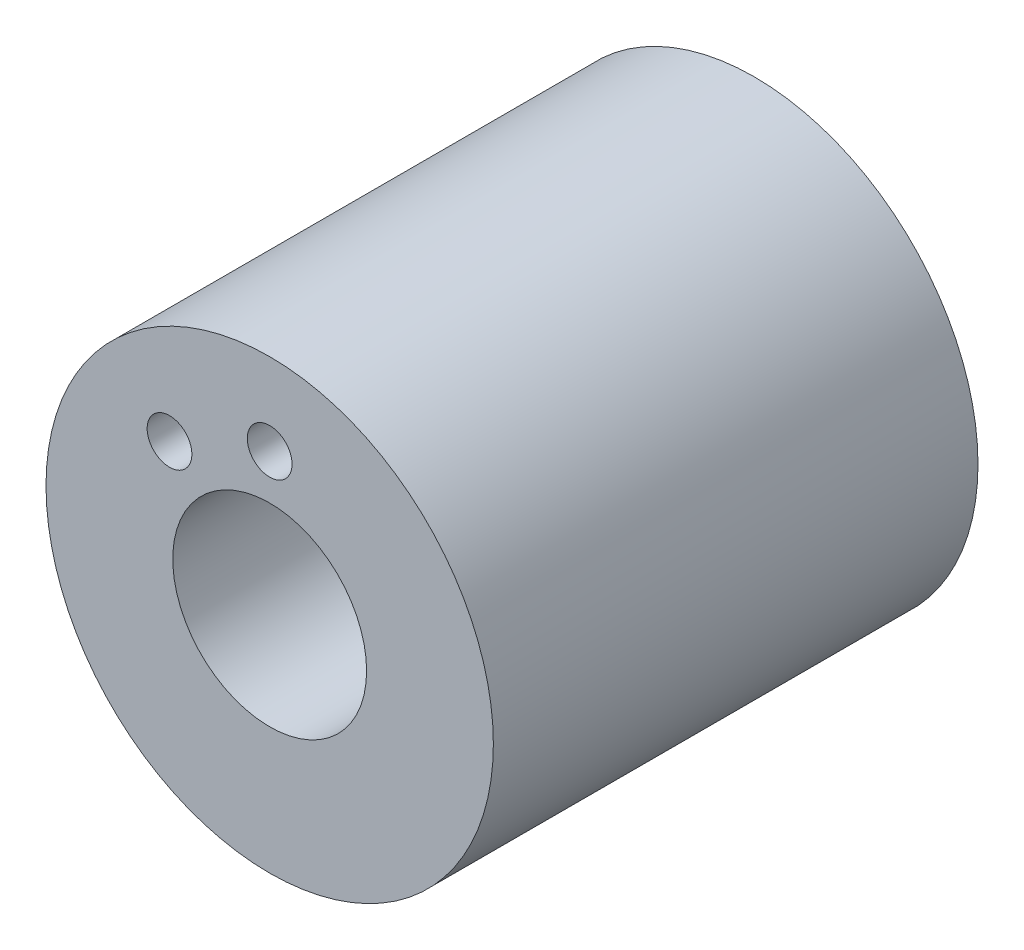
ISO-10303-21;
HEADER;
FILE_DESCRIPTION(('STEP AP214'),'2;1');
FILE_NAME('part.step','',(''),(''),'','','');
FILE_SCHEMA(('AUTOMOTIVE_DESIGN { 1 0 10303 214 1 1 1 1 }'));
ENDSEC;
DATA;
#1=APPLICATION_CONTEXT('core data for automotive mechanical design processes');
#2=APPLICATION_PROTOCOL_DEFINITION('international standard','automotive_design',2000,#1);
#3=PRODUCT_CONTEXT('',#1,'mechanical');
#4=PRODUCT('Part','Part','',(#3));
#5=PRODUCT_RELATED_PRODUCT_CATEGORY('part','',(#4));
#6=PRODUCT_DEFINITION_FORMATION('','',#4);
#7=PRODUCT_DEFINITION_CONTEXT('part definition',#1,'design');
#8=PRODUCT_DEFINITION('design','',#6,#7);
#9=PRODUCT_DEFINITION_SHAPE('','',#8);
#10=(LENGTH_UNIT() NAMED_UNIT(*) SI_UNIT(.MILLI.,.METRE.));
#11=(NAMED_UNIT(*) PLANE_ANGLE_UNIT() SI_UNIT($,.RADIAN.));
#12=(NAMED_UNIT(*) SI_UNIT($,.STERADIAN.) SOLID_ANGLE_UNIT());
#13=UNCERTAINTY_MEASURE_WITH_UNIT(LENGTH_MEASURE(1.E-05),#10,'distance_accuracy_value','');
#14=(GEOMETRIC_REPRESENTATION_CONTEXT(3) GLOBAL_UNCERTAINTY_ASSIGNED_CONTEXT((#13)) GLOBAL_UNIT_ASSIGNED_CONTEXT((#10,
#11,#12)) REPRESENTATION_CONTEXT('',''));
#15=CARTESIAN_POINT('',(0.,0.,0.));
#16=DIRECTION('',(0.,0.,1.));
#17=DIRECTION('',(1.,0.,0.));
#18=AXIS2_PLACEMENT_3D('',#15,#16,#17);
#19=CARTESIAN_POINT('',(0.,0.,16.25));
#20=DIRECTION('',(0.,0.,1.));
#21=DIRECTION('',(1.,0.,0.));
#22=AXIS2_PLACEMENT_3D('',#19,#20,#21);
#23=PLANE('',#22);
#24=CARTESIAN_POINT('',(0.,9.5,16.25));
#25=DIRECTION('',(0.,0.,1.));
#26=DIRECTION('',(1.,0.,0.));
#27=AXIS2_PLACEMENT_3D('',#24,#25,#26);
#28=CIRCLE('',#27,1.5);
#29=CARTESIAN_POINT('',(1.5,9.5,16.25));
#30=VERTEX_POINT('',#29);
#31=EDGE_CURVE('E47',#30,#30,#28,.T.);
#32=ORIENTED_EDGE('',*,*,#31,.F.);
#33=EDGE_LOOP('',(#32));
#34=FACE_BOUND('',#33,.T.);
#35=CARTESIAN_POINT('',(0.,0.,16.25));
#36=DIRECTION('',(0.,0.,1.));
#37=DIRECTION('',(1.,0.,0.));
#38=AXIS2_PLACEMENT_3D('',#35,#36,#37);
#39=CIRCLE('',#38,15.);
#40=CARTESIAN_POINT('',(15.,0.,16.25));
#41=VERTEX_POINT('',#40);
#42=EDGE_CURVE('E10',#41,#41,#39,.T.);
#43=ORIENTED_EDGE('',*,*,#42,.T.);
#44=EDGE_LOOP('',(#43));
#45=FACE_BOUND('',#44,.T.);
#46=CARTESIAN_POINT('',(0.,0.,16.25));
#47=DIRECTION('',(0.,0.,1.));
#48=DIRECTION('',(1.,0.,0.));
#49=AXIS2_PLACEMENT_3D('',#46,#47,#48);
#50=CIRCLE('',#49,6.5);
#51=CARTESIAN_POINT('',(6.5,0.,16.25));
#52=VERTEX_POINT('',#51);
#53=EDGE_CURVE('E42',#52,#52,#50,.T.);
#54=ORIENTED_EDGE('',*,*,#53,.F.);
#55=EDGE_LOOP('',(#54));
#56=FACE_BOUND('',#55,.T.);
#57=CARTESIAN_POINT('',(-6.71751442127221,6.71751442127219,16.25));
#58=DIRECTION('',(0.,0.,1.));
#59=DIRECTION('',(1.,0.,0.));
#60=AXIS2_PLACEMENT_3D('',#57,#58,#59);
#61=CIRCLE('',#60,1.5);
#62=CARTESIAN_POINT('',(-5.21751442127221,6.71751442127219,16.25));
#63=VERTEX_POINT('',#62);
#64=EDGE_CURVE('E53',#63,#63,#61,.T.);
#65=ORIENTED_EDGE('',*,*,#64,.F.);
#66=EDGE_LOOP('',(#65));
#67=FACE_BOUND('',#66,.T.);
#68=ADVANCED_FACE('F31',(#34,#45,#56,#67),#23,.T.);
#69=CARTESIAN_POINT('',(0.,0.,-16.25));
#70=DIRECTION('',(0.,0.,1.));
#71=DIRECTION('',(1.,0.,0.));
#72=AXIS2_PLACEMENT_3D('',#69,#70,#71);
#73=PLANE('',#72);
#74=CARTESIAN_POINT('',(0.,0.,-16.25));
#75=DIRECTION('',(0.,0.,1.));
#76=DIRECTION('',(1.,0.,0.));
#77=AXIS2_PLACEMENT_3D('',#74,#75,#76);
#78=CIRCLE('',#77,15.);
#79=CARTESIAN_POINT('',(15.,0.,-16.25));
#80=VERTEX_POINT('',#79);
#81=EDGE_CURVE('E35',#80,#80,#78,.T.);
#82=ORIENTED_EDGE('',*,*,#81,.F.);
#83=EDGE_LOOP('',(#82));
#84=FACE_BOUND('',#83,.T.);
#85=CARTESIAN_POINT('',(0.,0.,-16.25));
#86=DIRECTION('',(0.,0.,1.));
#87=DIRECTION('',(1.,0.,0.));
#88=AXIS2_PLACEMENT_3D('',#85,#86,#87);
#89=CIRCLE('',#88,6.5);
#90=CARTESIAN_POINT('',(6.5,0.,-16.25));
#91=VERTEX_POINT('',#90);
#92=EDGE_CURVE('E44',#91,#91,#89,.T.);
#93=ORIENTED_EDGE('',*,*,#92,.T.);
#94=EDGE_LOOP('',(#93));
#95=FACE_BOUND('',#94,.T.);
#96=CARTESIAN_POINT('',(0.,9.5,-16.25));
#97=DIRECTION('',(0.,0.,1.));
#98=DIRECTION('',(1.,0.,0.));
#99=AXIS2_PLACEMENT_3D('',#96,#97,#98);
#100=CIRCLE('',#99,1.5);
#101=CARTESIAN_POINT('',(1.5,9.5,-16.25));
#102=VERTEX_POINT('',#101);
#103=EDGE_CURVE('E50',#102,#102,#100,.T.);
#104=ORIENTED_EDGE('',*,*,#103,.T.);
#105=EDGE_LOOP('',(#104));
#106=FACE_BOUND('',#105,.T.);
#107=CARTESIAN_POINT('',(-6.71751442127221,6.71751442127219,-16.25));
#108=DIRECTION('',(0.,0.,1.));
#109=DIRECTION('',(1.,0.,0.));
#110=AXIS2_PLACEMENT_3D('',#107,#108,#109);
#111=CIRCLE('',#110,1.5);
#112=CARTESIAN_POINT('',(-5.21751442127221,6.71751442127219,-16.25));
#113=VERTEX_POINT('',#112);
#114=EDGE_CURVE('E56',#113,#113,#111,.T.);
#115=ORIENTED_EDGE('',*,*,#114,.T.);
#116=EDGE_LOOP('',(#115));
#117=FACE_BOUND('',#116,.T.);
#118=ADVANCED_FACE('F66',(#84,#95,#106,#117),#73,.F.);
#119=CARTESIAN_POINT('',(0.,0.,16.25));
#120=DIRECTION('',(0.,0.,-1.));
#121=DIRECTION('',(-1.,0.,0.));
#122=AXIS2_PLACEMENT_3D('',#119,#120,#121);
#123=CYLINDRICAL_SURFACE('',#122,15.);
#124=ORIENTED_EDGE('',*,*,#42,.F.);
#125=EDGE_LOOP('',(#124));
#126=FACE_BOUND('',#125,.T.);
#127=ORIENTED_EDGE('',*,*,#81,.T.);
#128=EDGE_LOOP('',(#127));
#129=FACE_BOUND('',#128,.T.);
#130=ADVANCED_FACE('F33',(#126,#129),#123,.T.);
#131=CARTESIAN_POINT('',(0.,0.,16.25));
#132=DIRECTION('',(0.,0.,-1.));
#133=DIRECTION('',(-1.,0.,0.));
#134=AXIS2_PLACEMENT_3D('',#131,#132,#133);
#135=CYLINDRICAL_SURFACE('',#134,6.5);
#136=ORIENTED_EDGE('',*,*,#53,.T.);
#137=EDGE_LOOP('',(#136));
#138=FACE_BOUND('',#137,.T.);
#139=ORIENTED_EDGE('',*,*,#92,.F.);
#140=EDGE_LOOP('',(#139));
#141=FACE_BOUND('',#140,.T.);
#142=ADVANCED_FACE('F75',(#138,#141),#135,.F.);
#143=CARTESIAN_POINT('',(0.,9.5,16.25));
#144=DIRECTION('',(0.,0.,-1.));
#145=DIRECTION('',(-1.,0.,0.));
#146=AXIS2_PLACEMENT_3D('',#143,#144,#145);
#147=CYLINDRICAL_SURFACE('',#146,1.5);
#148=ORIENTED_EDGE('',*,*,#31,.T.);
#149=EDGE_LOOP('',(#148));
#150=FACE_BOUND('',#149,.T.);
#151=ORIENTED_EDGE('',*,*,#103,.F.);
#152=EDGE_LOOP('',(#151));
#153=FACE_BOUND('',#152,.T.);
#154=ADVANCED_FACE('F78',(#150,#153),#147,.F.);
#155=CARTESIAN_POINT('',(-6.71751442127221,6.71751442127219,16.25));
#156=DIRECTION('',(0.,0.,-1.));
#157=DIRECTION('',(-1.,0.,0.));
#158=AXIS2_PLACEMENT_3D('',#155,#156,#157);
#159=CYLINDRICAL_SURFACE('',#158,1.5);
#160=ORIENTED_EDGE('',*,*,#64,.T.);
#161=EDGE_LOOP('',(#160));
#162=FACE_BOUND('',#161,.T.);
#163=ORIENTED_EDGE('',*,*,#114,.F.);
#164=EDGE_LOOP('',(#163));
#165=FACE_BOUND('',#164,.T.);
#166=ADVANCED_FACE('F62',(#162,#165),#159,.F.);
#167=CLOSED_SHELL('',(#68,#118,#130,#142,#154,#166));
#168=MANIFOLD_SOLID_BREP('B2',#167);
#169=ADVANCED_BREP_SHAPE_REPRESENTATION('',(#18,#168),#14);
#170=SHAPE_DEFINITION_REPRESENTATION(#9,#169);
ENDSEC;
END-ISO-10303-21;
